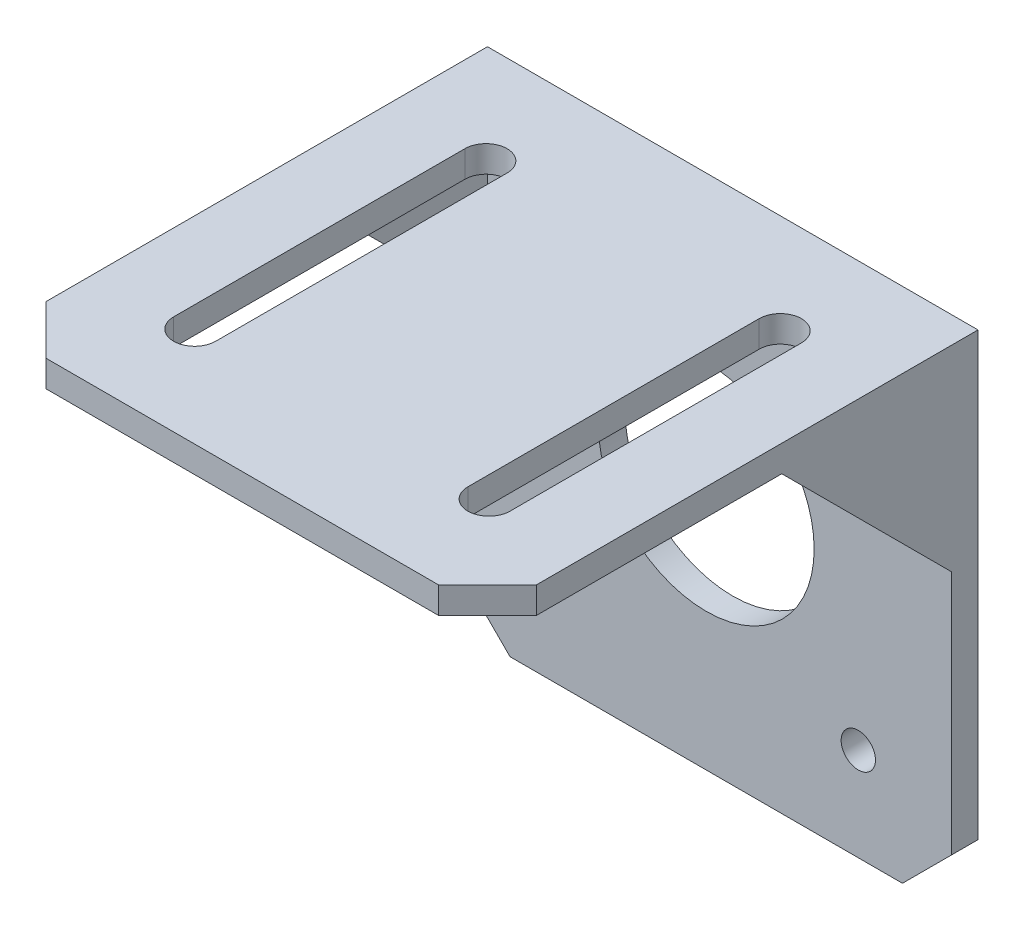
ISO-10303-21;
HEADER;
FILE_DESCRIPTION(('STEP AP214'),'2;1');
FILE_NAME('part.step','',(''),(''),'','','');
FILE_SCHEMA(('AUTOMOTIVE_DESIGN { 1 0 10303 214 1 1 1 1 }'));
ENDSEC;
DATA;
#1=APPLICATION_CONTEXT('core data for automotive mechanical design processes');
#2=APPLICATION_PROTOCOL_DEFINITION('international standard','automotive_design',2000,#1);
#3=PRODUCT_CONTEXT('',#1,'mechanical');
#4=PRODUCT('Part','Part','',(#3));
#5=PRODUCT_RELATED_PRODUCT_CATEGORY('part','',(#4));
#6=PRODUCT_DEFINITION_FORMATION('','',#4);
#7=PRODUCT_DEFINITION_CONTEXT('part definition',#1,'design');
#8=PRODUCT_DEFINITION('design','',#6,#7);
#9=PRODUCT_DEFINITION_SHAPE('','',#8);
#10=(LENGTH_UNIT() NAMED_UNIT(*) SI_UNIT(.MILLI.,.METRE.));
#11=(NAMED_UNIT(*) PLANE_ANGLE_UNIT() SI_UNIT($,.RADIAN.));
#12=(NAMED_UNIT(*) SI_UNIT($,.STERADIAN.) SOLID_ANGLE_UNIT());
#13=UNCERTAINTY_MEASURE_WITH_UNIT(LENGTH_MEASURE(1.E-05),#10,'distance_accuracy_value','');
#14=(GEOMETRIC_REPRESENTATION_CONTEXT(3) GLOBAL_UNCERTAINTY_ASSIGNED_CONTEXT((#13)) GLOBAL_UNIT_ASSIGNED_CONTEXT((#10,
#11,#12)) REPRESENTATION_CONTEXT('',''));
#15=CARTESIAN_POINT('',(0.,0.,0.));
#16=DIRECTION('',(0.,0.,1.));
#17=DIRECTION('',(1.,0.,0.));
#18=AXIS2_PLACEMENT_3D('',#15,#16,#17);
#19=CARTESIAN_POINT('',(0.,0.,0.));
#20=DIRECTION('',(0.,0.,1.));
#21=DIRECTION('',(1.,0.,0.));
#22=AXIS2_PLACEMENT_3D('',#19,#20,#21);
#23=PLANE('',#22);
#24=CARTESIAN_POINT('',(-15.5,15.5,0.));
#25=DIRECTION('',(0.,0.,-1.));
#26=DIRECTION('',(1.,0.,0.));
#27=AXIS2_PLACEMENT_3D('',#24,#25,#26);
#28=CIRCLE('',#27,1.75);
#29=CARTESIAN_POINT('',(-17.25,15.5,0.));
#30=VERTEX_POINT('',#29);
#31=EDGE_CURVE('E435',#30,#30,#28,.T.);
#32=ORIENTED_EDGE('',*,*,#31,.F.);
#33=EDGE_LOOP('',(#32));
#34=FACE_BOUND('',#33,.T.);
#35=CARTESIAN_POINT('',(-15.5,-15.5,0.));
#36=DIRECTION('',(0.,0.,-1.));
#37=DIRECTION('',(1.,0.,0.));
#38=AXIS2_PLACEMENT_3D('',#35,#36,#37);
#39=CIRCLE('',#38,1.75);
#40=CARTESIAN_POINT('',(-17.25,-15.5,0.));
#41=VERTEX_POINT('',#40);
#42=EDGE_CURVE('E367',#41,#41,#39,.T.);
#43=ORIENTED_EDGE('',*,*,#42,.F.);
#44=EDGE_LOOP('',(#43));
#45=FACE_BOUND('',#44,.T.);
#46=CARTESIAN_POINT('',(15.5,-15.5,0.));
#47=DIRECTION('',(0.,0.,-1.));
#48=DIRECTION('',(1.,0.,0.));
#49=AXIS2_PLACEMENT_3D('',#46,#47,#48);
#50=CIRCLE('',#49,1.75);
#51=CARTESIAN_POINT('',(13.75,-15.5,0.));
#52=VERTEX_POINT('',#51);
#53=EDGE_CURVE('E417',#52,#52,#50,.T.);
#54=ORIENTED_EDGE('',*,*,#53,.F.);
#55=EDGE_LOOP('',(#54));
#56=FACE_BOUND('',#55,.T.);
#57=CARTESIAN_POINT('',(0.,0.,0.));
#58=DIRECTION('',(0.,0.,-1.));
#59=DIRECTION('',(1.,0.,0.));
#60=AXIS2_PLACEMENT_3D('',#57,#58,#59);
#61=CIRCLE('',#60,11.);
#62=CARTESIAN_POINT('',(-11.,0.,0.));
#63=VERTEX_POINT('',#62);
#64=EDGE_CURVE('E307',#63,#63,#61,.T.);
#65=ORIENTED_EDGE('',*,*,#64,.F.);
#66=EDGE_LOOP('',(#65));
#67=FACE_BOUND('',#66,.T.);
#68=CARTESIAN_POINT('',(15.5,15.5,0.));
#69=DIRECTION('',(0.,0.,-1.));
#70=DIRECTION('',(1.,0.,0.));
#71=AXIS2_PLACEMENT_3D('',#68,#69,#70);
#72=CIRCLE('',#71,1.75);
#73=CARTESIAN_POINT('',(13.75,15.5,0.));
#74=VERTEX_POINT('',#73);
#75=EDGE_CURVE('E27',#74,#74,#72,.T.);
#76=ORIENTED_EDGE('',*,*,#75,.F.);
#77=EDGE_LOOP('',(#76));
#78=FACE_BOUND('',#77,.T.);
#79=DIRECTION('',(0.707106781186548,0.707106781186548,0.));
#80=VECTOR('',#79,1.);
#81=CARTESIAN_POINT('',(22.5,-22.5,0.));
#82=LINE('',#81,#80);
#83=CARTESIAN_POINT('',(20.,-25.,0.));
#84=VERTEX_POINT('',#83);
#85=CARTESIAN_POINT('',(25.,-20.,0.));
#86=VERTEX_POINT('',#85);
#87=EDGE_CURVE('E336',#84,#86,#82,.T.);
#88=ORIENTED_EDGE('',*,*,#87,.F.);
#89=DIRECTION('',(-1.,0.,0.));
#90=VECTOR('',#89,1.);
#91=CARTESIAN_POINT('',(25.,-25.,0.));
#92=LINE('',#91,#90);
#93=CARTESIAN_POINT('',(-20.,-25.,0.));
#94=VERTEX_POINT('',#93);
#95=EDGE_CURVE('E468',#84,#94,#92,.T.);
#96=ORIENTED_EDGE('',*,*,#95,.T.);
#97=DIRECTION('',(0.707106781186548,-0.707106781186548,0.));
#98=VECTOR('',#97,1.);
#99=CARTESIAN_POINT('',(-22.5,-22.5,0.));
#100=LINE('',#99,#98);
#101=CARTESIAN_POINT('',(-25.,-20.,0.));
#102=VERTEX_POINT('',#101);
#103=EDGE_CURVE('E329',#102,#94,#100,.T.);
#104=ORIENTED_EDGE('',*,*,#103,.F.);
#105=DIRECTION('',(0.,1.,0.));
#106=VECTOR('',#105,1.);
#107=CARTESIAN_POINT('',(-25.,-25.,0.));
#108=LINE('',#107,#106);
#109=CARTESIAN_POINT('',(-25.,25.,0.));
#110=VERTEX_POINT('',#109);
#111=EDGE_CURVE('E282',#102,#110,#108,.T.);
#112=ORIENTED_EDGE('',*,*,#111,.T.);
#113=DIRECTION('',(1.,0.,0.));
#114=VECTOR('',#113,1.);
#115=CARTESIAN_POINT('',(-25.,25.,0.));
#116=LINE('',#115,#114);
#117=CARTESIAN_POINT('',(25.,25.,0.));
#118=VERTEX_POINT('',#117);
#119=EDGE_CURVE('E392',#110,#118,#116,.T.);
#120=ORIENTED_EDGE('',*,*,#119,.T.);
#121=DIRECTION('',(0.,-1.,0.));
#122=VECTOR('',#121,1.);
#123=CARTESIAN_POINT('',(25.,25.,0.));
#124=LINE('',#123,#122);
#125=EDGE_CURVE('E11',#118,#86,#124,.T.);
#126=ORIENTED_EDGE('',*,*,#125,.T.);
#127=EDGE_LOOP('',(#88,#96,#104,#112,#120,#126));
#128=FACE_BOUND('',#127,.T.);
#129=ADVANCED_FACE('F16',(#34,#45,#56,#67,#78,#128),#23,.F.);
#130=CARTESIAN_POINT('',(25.,-25.,0.));
#131=DIRECTION('',(1.,0.,0.));
#132=DIRECTION('',(0.,1.,0.));
#133=AXIS2_PLACEMENT_3D('',#130,#131,#132);
#134=PLANE('',#133);
#135=DIRECTION('',(0.,0.,1.));
#136=VECTOR('',#135,1.);
#137=CARTESIAN_POINT('',(25.,-20.,0.));
#138=LINE('',#137,#136);
#139=CARTESIAN_POINT('',(25.,-20.,2.7));
#140=VERTEX_POINT('',#139);
#141=EDGE_CURVE('E331',#86,#140,#138,.T.);
#142=ORIENTED_EDGE('',*,*,#141,.F.);
#143=ORIENTED_EDGE('',*,*,#125,.F.);
#144=DIRECTION('',(0.,0.,1.));
#145=VECTOR('',#144,1.);
#146=CARTESIAN_POINT('',(25.,25.,0.));
#147=LINE('',#146,#145);
#148=CARTESIAN_POINT('',(25.,25.,45.));
#149=VERTEX_POINT('',#148);
#150=EDGE_CURVE('E352',#118,#149,#147,.T.);
#151=ORIENTED_EDGE('',*,*,#150,.T.);
#152=DIRECTION('',(0.,1.,0.));
#153=VECTOR('',#152,1.);
#154=CARTESIAN_POINT('',(25.,0.,45.));
#155=LINE('',#154,#153);
#156=CARTESIAN_POINT('',(25.,22.3,45.));
#157=VERTEX_POINT('',#156);
#158=EDGE_CURVE('E429',#157,#149,#155,.T.);
#159=ORIENTED_EDGE('',*,*,#158,.F.);
#160=DIRECTION('',(0.,0.,1.));
#161=VECTOR('',#160,1.);
#162=CARTESIAN_POINT('',(25.,22.3,50.));
#163=LINE('',#162,#161);
#164=CARTESIAN_POINT('',(25.,22.3,20.));
#165=VERTEX_POINT('',#164);
#166=EDGE_CURVE('E201',#165,#157,#163,.T.);
#167=ORIENTED_EDGE('',*,*,#166,.F.);
#168=DIRECTION('',(0.,0.707106781186548,0.707106781186548));
#169=VECTOR('',#168,1.);
#170=CARTESIAN_POINT('',(25.,5.,2.7));
#171=LINE('',#170,#169);
#172=CARTESIAN_POINT('',(25.,5.,2.7));
#173=VERTEX_POINT('',#172);
#174=EDGE_CURVE('E257',#173,#165,#171,.T.);
#175=ORIENTED_EDGE('',*,*,#174,.F.);
#176=DIRECTION('',(0.,1.,0.));
#177=VECTOR('',#176,1.);
#178=CARTESIAN_POINT('',(25.,25.,2.7));
#179=LINE('',#178,#177);
#180=EDGE_CURVE('E486',#140,#173,#179,.T.);
#181=ORIENTED_EDGE('',*,*,#180,.F.);
#182=EDGE_LOOP('',(#142,#143,#151,#159,#167,#175,#181));
#183=FACE_BOUND('',#182,.T.);
#184=ADVANCED_FACE('F572',(#183),#134,.T.);
#185=CARTESIAN_POINT('',(15.5,15.5,0.));
#186=DIRECTION('',(0.,0.,1.));
#187=DIRECTION('',(1.,0.,0.));
#188=AXIS2_PLACEMENT_3D('',#185,#186,#187);
#189=CYLINDRICAL_SURFACE('',#188,1.75);
#190=CARTESIAN_POINT('',(15.5,15.5,2.7));
#191=DIRECTION('',(0.,0.,-1.));
#192=DIRECTION('',(1.,0.,0.));
#193=AXIS2_PLACEMENT_3D('',#190,#191,#192);
#194=CIRCLE('',#193,1.75);
#195=CARTESIAN_POINT('',(13.75,15.5,2.7));
#196=VERTEX_POINT('',#195);
#197=EDGE_CURVE('E330',#196,#196,#194,.T.);
#198=ORIENTED_EDGE('',*,*,#197,.F.);
#199=DIRECTION('',(0.,0.,-1.));
#200=VECTOR('',#199,1.);
#201=CARTESIAN_POINT('',(13.75,15.5,0.));
#202=LINE('',#201,#200);
#203=EDGE_CURVE('E436',#196,#74,#202,.T.);
#204=ORIENTED_EDGE('',*,*,#203,.T.);
#205=ORIENTED_EDGE('',*,*,#75,.T.);
#206=ORIENTED_EDGE('',*,*,#203,.F.);
#207=EDGE_LOOP('',(#198,#204,#205,#206));
#208=FACE_BOUND('',#207,.T.);
#209=ADVANCED_FACE('F778',(#208),#189,.F.);
#210=CARTESIAN_POINT('',(0.,0.,0.));
#211=DIRECTION('',(0.,0.,1.));
#212=DIRECTION('',(1.,0.,0.));
#213=AXIS2_PLACEMENT_3D('',#210,#211,#212);
#214=CYLINDRICAL_SURFACE('',#213,11.);
#215=CARTESIAN_POINT('',(0.,0.,2.7));
#216=DIRECTION('',(0.,0.,-1.));
#217=DIRECTION('',(1.,0.,0.));
#218=AXIS2_PLACEMENT_3D('',#215,#216,#217);
#219=CIRCLE('',#218,11.);
#220=CARTESIAN_POINT('',(-11.,0.,2.7));
#221=VERTEX_POINT('',#220);
#222=EDGE_CURVE('E362',#221,#221,#219,.T.);
#223=ORIENTED_EDGE('',*,*,#222,.F.);
#224=DIRECTION('',(0.,0.,-1.));
#225=VECTOR('',#224,1.);
#226=CARTESIAN_POINT('',(-11.,0.,0.));
#227=LINE('',#226,#225);
#228=EDGE_CURVE('E267',#221,#63,#227,.T.);
#229=ORIENTED_EDGE('',*,*,#228,.T.);
#230=ORIENTED_EDGE('',*,*,#64,.T.);
#231=ORIENTED_EDGE('',*,*,#228,.F.);
#232=EDGE_LOOP('',(#223,#229,#230,#231));
#233=FACE_BOUND('',#232,.T.);
#234=ADVANCED_FACE('F772',(#233),#214,.F.);
#235=CARTESIAN_POINT('',(15.5,-15.5,0.));
#236=DIRECTION('',(0.,0.,1.));
#237=DIRECTION('',(1.,0.,0.));
#238=AXIS2_PLACEMENT_3D('',#235,#236,#237);
#239=CYLINDRICAL_SURFACE('',#238,1.75);
#240=CARTESIAN_POINT('',(15.5,-15.5,2.7));
#241=DIRECTION('',(0.,0.,-1.));
#242=DIRECTION('',(1.,0.,0.));
#243=AXIS2_PLACEMENT_3D('',#240,#241,#242);
#244=CIRCLE('',#243,1.75);
#245=CARTESIAN_POINT('',(13.75,-15.5,2.7));
#246=VERTEX_POINT('',#245);
#247=EDGE_CURVE('E358',#246,#246,#244,.T.);
#248=ORIENTED_EDGE('',*,*,#247,.F.);
#249=DIRECTION('',(0.,0.,-1.));
#250=VECTOR('',#249,1.);
#251=CARTESIAN_POINT('',(13.75,-15.5,0.));
#252=LINE('',#251,#250);
#253=EDGE_CURVE('E371',#246,#52,#252,.T.);
#254=ORIENTED_EDGE('',*,*,#253,.T.);
#255=ORIENTED_EDGE('',*,*,#53,.T.);
#256=ORIENTED_EDGE('',*,*,#253,.F.);
#257=EDGE_LOOP('',(#248,#254,#255,#256));
#258=FACE_BOUND('',#257,.T.);
#259=ADVANCED_FACE('F777',(#258),#239,.F.);
#260=CARTESIAN_POINT('',(-15.5,-15.5,0.));
#261=DIRECTION('',(0.,0.,1.));
#262=DIRECTION('',(1.,0.,0.));
#263=AXIS2_PLACEMENT_3D('',#260,#261,#262);
#264=CYLINDRICAL_SURFACE('',#263,1.75);
#265=CARTESIAN_POINT('',(-15.5,-15.5,2.7));
#266=DIRECTION('',(0.,0.,-1.));
#267=DIRECTION('',(1.,0.,0.));
#268=AXIS2_PLACEMENT_3D('',#265,#266,#267);
#269=CIRCLE('',#268,1.75);
#270=CARTESIAN_POINT('',(-17.25,-15.5,2.7));
#271=VERTEX_POINT('',#270);
#272=EDGE_CURVE('E363',#271,#271,#269,.T.);
#273=ORIENTED_EDGE('',*,*,#272,.F.);
#274=DIRECTION('',(0.,0.,-1.));
#275=VECTOR('',#274,1.);
#276=CARTESIAN_POINT('',(-17.25,-15.5,0.));
#277=LINE('',#276,#275);
#278=EDGE_CURVE('E372',#271,#41,#277,.T.);
#279=ORIENTED_EDGE('',*,*,#278,.T.);
#280=ORIENTED_EDGE('',*,*,#42,.T.);
#281=ORIENTED_EDGE('',*,*,#278,.F.);
#282=EDGE_LOOP('',(#273,#279,#280,#281));
#283=FACE_BOUND('',#282,.T.);
#284=ADVANCED_FACE('F18',(#283),#264,.F.);
#285=CARTESIAN_POINT('',(-15.5,15.5,0.));
#286=DIRECTION('',(0.,0.,1.));
#287=DIRECTION('',(1.,0.,0.));
#288=AXIS2_PLACEMENT_3D('',#285,#286,#287);
#289=CYLINDRICAL_SURFACE('',#288,1.75);
#290=CARTESIAN_POINT('',(-15.5,15.5,2.7));
#291=DIRECTION('',(0.,0.,-1.));
#292=DIRECTION('',(1.,0.,0.));
#293=AXIS2_PLACEMENT_3D('',#290,#291,#292);
#294=CIRCLE('',#293,1.75);
#295=CARTESIAN_POINT('',(-17.25,15.5,2.7));
#296=VERTEX_POINT('',#295);
#297=EDGE_CURVE('E385',#296,#296,#294,.T.);
#298=ORIENTED_EDGE('',*,*,#297,.F.);
#299=DIRECTION('',(0.,0.,-1.));
#300=VECTOR('',#299,1.);
#301=CARTESIAN_POINT('',(-17.25,15.5,0.));
#302=LINE('',#301,#300);
#303=EDGE_CURVE('E431',#296,#30,#302,.T.);
#304=ORIENTED_EDGE('',*,*,#303,.T.);
#305=ORIENTED_EDGE('',*,*,#31,.T.);
#306=ORIENTED_EDGE('',*,*,#303,.F.);
#307=EDGE_LOOP('',(#298,#304,#305,#306));
#308=FACE_BOUND('',#307,.T.);
#309=ADVANCED_FACE('F719',(#308),#289,.F.);
#310=CARTESIAN_POINT('',(0.,22.3,26.35));
#311=DIRECTION('',(0.,-1.,0.));
#312=DIRECTION('',(0.,0.,-1.));
#313=AXIS2_PLACEMENT_3D('',#310,#311,#312);
#314=PLANE('',#313);
#315=DIRECTION('',(0.,0.,1.));
#316=VECTOR('',#315,1.);
#317=CARTESIAN_POINT('',(-17.15,22.3,33.1));
#318=LINE('',#317,#316);
#319=CARTESIAN_POINT('',(-17.15,22.3,10.15));
#320=VERTEX_POINT('',#319);
#321=CARTESIAN_POINT('',(-17.15,22.3,39.85));
#322=VERTEX_POINT('',#321);
#323=EDGE_CURVE('E421',#320,#322,#318,.T.);
#324=ORIENTED_EDGE('',*,*,#323,.T.);
#325=CARTESIAN_POINT('',(-15.,22.3,39.85));
#326=DIRECTION('',(0.,1.,0.));
#327=DIRECTION('',(-1.,0.,0.));
#328=AXIS2_PLACEMENT_3D('',#325,#326,#327);
#329=CIRCLE('',#328,2.15);
#330=CARTESIAN_POINT('',(-12.85,22.3,39.85));
#331=VERTEX_POINT('',#330);
#332=EDGE_CURVE('E412',#322,#331,#329,.T.);
#333=ORIENTED_EDGE('',*,*,#332,.T.);
#334=DIRECTION('',(0.,0.,-1.));
#335=VECTOR('',#334,1.);
#336=CARTESIAN_POINT('',(-12.85,22.3,18.25));
#337=LINE('',#336,#335);
#338=CARTESIAN_POINT('',(-12.85,22.3,10.15));
#339=VERTEX_POINT('',#338);
#340=EDGE_CURVE('E346',#331,#339,#337,.T.);
#341=ORIENTED_EDGE('',*,*,#340,.T.);
#342=CARTESIAN_POINT('',(-15.,22.3,10.15));
#343=DIRECTION('',(0.,1.,0.));
#344=DIRECTION('',(1.,0.,0.));
#345=AXIS2_PLACEMENT_3D('',#342,#343,#344);
#346=CIRCLE('',#345,2.15);
#347=EDGE_CURVE('E345',#339,#320,#346,.T.);
#348=ORIENTED_EDGE('',*,*,#347,.T.);
#349=EDGE_LOOP('',(#324,#333,#341,#348));
#350=FACE_BOUND('',#349,.T.);
#351=DIRECTION('',(0.,0.,1.));
#352=VECTOR('',#351,1.);
#353=CARTESIAN_POINT('',(12.85,22.3,33.1));
#354=LINE('',#353,#352);
#355=CARTESIAN_POINT('',(12.85,22.3,10.15));
#356=VERTEX_POINT('',#355);
#357=CARTESIAN_POINT('',(12.85,22.3,39.85));
#358=VERTEX_POINT('',#357);
#359=EDGE_CURVE('E377',#356,#358,#354,.T.);
#360=ORIENTED_EDGE('',*,*,#359,.T.);
#361=CARTESIAN_POINT('',(15.,22.3,39.85));
#362=DIRECTION('',(0.,1.,0.));
#363=DIRECTION('',(-1.,0.,0.));
#364=AXIS2_PLACEMENT_3D('',#361,#362,#363);
#365=CIRCLE('',#364,2.15);
#366=CARTESIAN_POINT('',(17.15,22.3,39.85));
#367=VERTEX_POINT('',#366);
#368=EDGE_CURVE('E273',#358,#367,#365,.T.);
#369=ORIENTED_EDGE('',*,*,#368,.T.);
#370=DIRECTION('',(0.,0.,-1.));
#371=VECTOR('',#370,1.);
#372=CARTESIAN_POINT('',(17.15,22.3,18.25));
#373=LINE('',#372,#371);
#374=CARTESIAN_POINT('',(17.15,22.3,10.15));
#375=VERTEX_POINT('',#374);
#376=EDGE_CURVE('E314',#367,#375,#373,.T.);
#377=ORIENTED_EDGE('',*,*,#376,.T.);
#378=CARTESIAN_POINT('',(15.,22.3,10.15));
#379=DIRECTION('',(0.,1.,0.));
#380=DIRECTION('',(1.,0.,0.));
#381=AXIS2_PLACEMENT_3D('',#378,#379,#380);
#382=CIRCLE('',#381,2.15);
#383=EDGE_CURVE('E313',#375,#356,#382,.T.);
#384=ORIENTED_EDGE('',*,*,#383,.T.);
#385=EDGE_LOOP('',(#360,#369,#377,#384));
#386=FACE_BOUND('',#385,.T.);
#387=DIRECTION('',(0.707106781186548,0.,-0.707106781186548));
#388=VECTOR('',#387,1.);
#389=CARTESIAN_POINT('',(22.1625,22.3,47.8375));
#390=LINE('',#389,#388);
#391=CARTESIAN_POINT('',(20.,22.3,50.));
#392=VERTEX_POINT('',#391);
#393=EDGE_CURVE('E292',#392,#157,#390,.T.);
#394=ORIENTED_EDGE('',*,*,#393,.F.);
#395=DIRECTION('',(-1.,0.,0.));
#396=VECTOR('',#395,1.);
#397=CARTESIAN_POINT('',(-25.,22.3,50.));
#398=LINE('',#397,#396);
#399=CARTESIAN_POINT('',(-20.,22.3,50.));
#400=VERTEX_POINT('',#399);
#401=EDGE_CURVE('E192',#392,#400,#398,.T.);
#402=ORIENTED_EDGE('',*,*,#401,.T.);
#403=DIRECTION('',(0.707106781186549,0.,0.707106781186546));
#404=VECTOR('',#403,1.);
#405=CARTESIAN_POINT('',(-22.1625,22.3,47.8375));
#406=LINE('',#405,#404);
#407=CARTESIAN_POINT('',(-25.,22.3,45.));
#408=VERTEX_POINT('',#407);
#409=EDGE_CURVE('E357',#408,#400,#406,.T.);
#410=ORIENTED_EDGE('',*,*,#409,.F.);
#411=DIRECTION('',(0.,0.,-1.));
#412=VECTOR('',#411,1.);
#413=CARTESIAN_POINT('',(-25.,22.3,0.));
#414=LINE('',#413,#412);
#415=CARTESIAN_POINT('',(-25.,22.3,20.));
#416=VERTEX_POINT('',#415);
#417=EDGE_CURVE('E295',#408,#416,#414,.T.);
#418=ORIENTED_EDGE('',*,*,#417,.T.);
#419=DIRECTION('',(1.,0.,0.));
#420=VECTOR('',#419,1.);
#421=CARTESIAN_POINT('',(-12.5,22.3,20.));
#422=LINE('',#421,#420);
#423=CARTESIAN_POINT('',(-22.3,22.3,20.));
#424=VERTEX_POINT('',#423);
#425=EDGE_CURVE('E356',#416,#424,#422,.T.);
#426=ORIENTED_EDGE('',*,*,#425,.T.);
#427=DIRECTION('',(0.,0.,-1.));
#428=VECTOR('',#427,1.);
#429=CARTESIAN_POINT('',(-22.3,22.3,18.85));
#430=LINE('',#429,#428);
#431=CARTESIAN_POINT('',(-22.3,22.3,2.7));
#432=VERTEX_POINT('',#431);
#433=EDGE_CURVE('E169',#424,#432,#430,.T.);
#434=ORIENTED_EDGE('',*,*,#433,.T.);
#435=DIRECTION('',(-1.,0.,0.));
#436=VECTOR('',#435,1.);
#437=CARTESIAN_POINT('',(0.,22.3,2.7));
#438=LINE('',#437,#436);
#439=CARTESIAN_POINT('',(22.3,22.3,2.7));
#440=VERTEX_POINT('',#439);
#441=EDGE_CURVE('E241',#440,#432,#438,.T.);
#442=ORIENTED_EDGE('',*,*,#441,.F.);
#443=DIRECTION('',(0.,0.,1.));
#444=VECTOR('',#443,1.);
#445=CARTESIAN_POINT('',(22.3,22.3,18.85));
#446=LINE('',#445,#444);
#447=CARTESIAN_POINT('',(22.3,22.3,20.));
#448=VERTEX_POINT('',#447);
#449=EDGE_CURVE('E234',#440,#448,#446,.T.);
#450=ORIENTED_EDGE('',*,*,#449,.T.);
#451=DIRECTION('',(1.,0.,0.));
#452=VECTOR('',#451,1.);
#453=CARTESIAN_POINT('',(12.5,22.3,20.));
#454=LINE('',#453,#452);
#455=EDGE_CURVE('E238',#448,#165,#454,.T.);
#456=ORIENTED_EDGE('',*,*,#455,.T.);
#457=ORIENTED_EDGE('',*,*,#166,.T.);
#458=EDGE_LOOP('',(#394,#402,#410,#418,#426,#434,#442,#450,#456,#457));
#459=FACE_BOUND('',#458,.T.);
#460=ADVANCED_FACE('F236',(#350,#386,#459),#314,.T.);
#461=CARTESIAN_POINT('',(22.3,13.65,11.35));
#462=DIRECTION('',(-1.,0.,0.));
#463=DIRECTION('',(0.,0.,1.));
#464=AXIS2_PLACEMENT_3D('',#461,#462,#463);
#465=PLANE('',#464);
#466=DIRECTION('',(0.,1.,0.));
#467=VECTOR('',#466,1.);
#468=CARTESIAN_POINT('',(22.3,6.825,2.7));
#469=LINE('',#468,#467);
#470=CARTESIAN_POINT('',(22.3,5.,2.7));
#471=VERTEX_POINT('',#470);
#472=EDGE_CURVE('E250',#471,#440,#469,.T.);
#473=ORIENTED_EDGE('',*,*,#472,.F.);
#474=DIRECTION('',(0.,0.707106781186548,0.707106781186548));
#475=VECTOR('',#474,1.);
#476=CARTESIAN_POINT('',(22.3,5.,2.7));
#477=LINE('',#476,#475);
#478=EDGE_CURVE('E246',#471,#448,#477,.T.);
#479=ORIENTED_EDGE('',*,*,#478,.T.);
#480=ORIENTED_EDGE('',*,*,#449,.F.);
#481=EDGE_LOOP('',(#473,#479,#480));
#482=FACE_BOUND('',#481,.T.);
#483=ADVANCED_FACE('F249',(#482),#465,.T.);
#484=CARTESIAN_POINT('',(25.,5.,2.7));
#485=DIRECTION('',(0.,-0.707106781186548,0.707106781186548));
#486=DIRECTION('',(-1.,0.,0.));
#487=AXIS2_PLACEMENT_3D('',#484,#485,#486);
#488=PLANE('',#487);
#489=ORIENTED_EDGE('',*,*,#174,.T.);
#490=ORIENTED_EDGE('',*,*,#455,.F.);
#491=ORIENTED_EDGE('',*,*,#478,.F.);
#492=DIRECTION('',(-1.,0.,0.));
#493=VECTOR('',#492,1.);
#494=CARTESIAN_POINT('',(12.5,5.,2.7));
#495=LINE('',#494,#493);
#496=EDGE_CURVE('E341',#173,#471,#495,.T.);
#497=ORIENTED_EDGE('',*,*,#496,.F.);
#498=EDGE_LOOP('',(#489,#490,#491,#497));
#499=FACE_BOUND('',#498,.T.);
#500=ADVANCED_FACE('F256',(#499),#488,.T.);
#501=CARTESIAN_POINT('',(-22.3,13.65,11.35));
#502=DIRECTION('',(1.,0.,0.));
#503=DIRECTION('',(0.,1.,0.));
#504=AXIS2_PLACEMENT_3D('',#501,#502,#503);
#505=PLANE('',#504);
#506=ORIENTED_EDGE('',*,*,#433,.F.);
#507=DIRECTION('',(0.,-0.707106781186548,-0.707106781186548));
#508=VECTOR('',#507,1.);
#509=CARTESIAN_POINT('',(-22.3,5.,2.7));
#510=LINE('',#509,#508);
#511=CARTESIAN_POINT('',(-22.3,5.,2.7));
#512=VERTEX_POINT('',#511);
#513=EDGE_CURVE('E153',#424,#512,#510,.T.);
#514=ORIENTED_EDGE('',*,*,#513,.T.);
#515=DIRECTION('',(0.,-1.,0.));
#516=VECTOR('',#515,1.);
#517=CARTESIAN_POINT('',(-22.3,6.825,2.7));
#518=LINE('',#517,#516);
#519=EDGE_CURVE('E278',#432,#512,#518,.T.);
#520=ORIENTED_EDGE('',*,*,#519,.F.);
#521=EDGE_LOOP('',(#506,#514,#520));
#522=FACE_BOUND('',#521,.T.);
#523=ADVANCED_FACE('F737',(#522),#505,.T.);
#524=CARTESIAN_POINT('',(-25.,22.3,20.));
#525=DIRECTION('',(0.,-0.707106781186548,0.707106781186548));
#526=DIRECTION('',(-1.,0.,0.));
#527=AXIS2_PLACEMENT_3D('',#524,#525,#526);
#528=PLANE('',#527);
#529=DIRECTION('',(0.,0.707106781186548,0.707106781186548));
#530=VECTOR('',#529,1.);
#531=CARTESIAN_POINT('',(-25.,5.,2.7));
#532=LINE('',#531,#530);
#533=CARTESIAN_POINT('',(-25.,5.,2.7));
#534=VERTEX_POINT('',#533);
#535=EDGE_CURVE('E303',#534,#416,#532,.T.);
#536=ORIENTED_EDGE('',*,*,#535,.F.);
#537=DIRECTION('',(-1.,0.,0.));
#538=VECTOR('',#537,1.);
#539=CARTESIAN_POINT('',(-12.5,5.,2.7));
#540=LINE('',#539,#538);
#541=EDGE_CURVE('E274',#512,#534,#540,.T.);
#542=ORIENTED_EDGE('',*,*,#541,.F.);
#543=ORIENTED_EDGE('',*,*,#513,.F.);
#544=ORIENTED_EDGE('',*,*,#425,.F.);
#545=EDGE_LOOP('',(#536,#542,#543,#544));
#546=FACE_BOUND('',#545,.T.);
#547=ADVANCED_FACE('F806',(#546),#528,.T.);
#548=CARTESIAN_POINT('',(-22.5,25.,47.5));
#549=DIRECTION('',(-0.707106781186546,0.,0.707106781186549));
#550=DIRECTION('',(0.,1.,0.));
#551=AXIS2_PLACEMENT_3D('',#548,#549,#550);
#552=PLANE('',#551);
#553=ORIENTED_EDGE('',*,*,#409,.T.);
#554=DIRECTION('',(0.,1.,0.));
#555=VECTOR('',#554,1.);
#556=CARTESIAN_POINT('',(-20.,25.,50.));
#557=LINE('',#556,#555);
#558=CARTESIAN_POINT('',(-20.,25.,50.));
#559=VERTEX_POINT('',#558);
#560=EDGE_CURVE('E353',#400,#559,#557,.T.);
#561=ORIENTED_EDGE('',*,*,#560,.T.);
#562=DIRECTION('',(-0.707106781186549,0.,-0.707106781186546));
#563=VECTOR('',#562,1.);
#564=CARTESIAN_POINT('',(-22.5,25.,47.5));
#565=LINE('',#564,#563);
#566=CARTESIAN_POINT('',(-25.,25.,45.));
#567=VERTEX_POINT('',#566);
#568=EDGE_CURVE('E387',#559,#567,#565,.T.);
#569=ORIENTED_EDGE('',*,*,#568,.T.);
#570=DIRECTION('',(0.,-1.,0.));
#571=VECTOR('',#570,1.);
#572=CARTESIAN_POINT('',(-25.,25.,45.));
#573=LINE('',#572,#571);
#574=EDGE_CURVE('E283',#567,#408,#573,.T.);
#575=ORIENTED_EDGE('',*,*,#574,.T.);
#576=EDGE_LOOP('',(#553,#561,#569,#575));
#577=FACE_BOUND('',#576,.T.);
#578=ADVANCED_FACE('F811',(#577),#552,.T.);
#579=CARTESIAN_POINT('',(25.,25.,0.));
#580=DIRECTION('',(0.,1.,0.));
#581=DIRECTION('',(1.,0.,0.));
#582=AXIS2_PLACEMENT_3D('',#579,#580,#581);
#583=PLANE('',#582);
#584=DIRECTION('',(0.,0.,-1.));
#585=VECTOR('',#584,1.);
#586=CARTESIAN_POINT('',(-17.15,25.,19.925));
#587=LINE('',#586,#585);
#588=CARTESIAN_POINT('',(-17.15,25.,39.85));
#589=VERTEX_POINT('',#588);
#590=CARTESIAN_POINT('',(-17.15,25.,10.15));
#591=VERTEX_POINT('',#590);
#592=EDGE_CURVE('E441',#589,#591,#587,.T.);
#593=ORIENTED_EDGE('',*,*,#592,.T.);
#594=CARTESIAN_POINT('',(-15.,25.,10.15));
#595=DIRECTION('',(0.,-1.,0.));
#596=DIRECTION('',(1.,0.,0.));
#597=AXIS2_PLACEMENT_3D('',#594,#595,#596);
#598=CIRCLE('',#597,2.15);
#599=CARTESIAN_POINT('',(-12.85,25.,10.15));
#600=VERTEX_POINT('',#599);
#601=EDGE_CURVE('E342',#591,#600,#598,.T.);
#602=ORIENTED_EDGE('',*,*,#601,.T.);
#603=DIRECTION('',(0.,0.,1.));
#604=VECTOR('',#603,1.);
#605=CARTESIAN_POINT('',(-12.85,25.,5.075));
#606=LINE('',#605,#604);
#607=CARTESIAN_POINT('',(-12.85,25.,39.85));
#608=VERTEX_POINT('',#607);
#609=EDGE_CURVE('E478',#600,#608,#606,.T.);
#610=ORIENTED_EDGE('',*,*,#609,.T.);
#611=CARTESIAN_POINT('',(-15.,25.,39.85));
#612=DIRECTION('',(0.,-1.,0.));
#613=DIRECTION('',(-1.,0.,0.));
#614=AXIS2_PLACEMENT_3D('',#611,#612,#613);
#615=CIRCLE('',#614,2.15);
#616=EDGE_CURVE('E413',#608,#589,#615,.T.);
#617=ORIENTED_EDGE('',*,*,#616,.T.);
#618=EDGE_LOOP('',(#593,#602,#610,#617));
#619=FACE_BOUND('',#618,.T.);
#620=DIRECTION('',(0.,0.,-1.));
#621=VECTOR('',#620,1.);
#622=CARTESIAN_POINT('',(12.85,25.,19.925));
#623=LINE('',#622,#621);
#624=CARTESIAN_POINT('',(12.85,25.,39.85));
#625=VERTEX_POINT('',#624);
#626=CARTESIAN_POINT('',(12.85,25.,10.15));
#627=VERTEX_POINT('',#626);
#628=EDGE_CURVE('E382',#625,#627,#623,.T.);
#629=ORIENTED_EDGE('',*,*,#628,.T.);
#630=CARTESIAN_POINT('',(15.,25.,10.15));
#631=DIRECTION('',(0.,-1.,0.));
#632=DIRECTION('',(1.,0.,0.));
#633=AXIS2_PLACEMENT_3D('',#630,#631,#632);
#634=CIRCLE('',#633,2.15);
#635=CARTESIAN_POINT('',(17.15,25.,10.15));
#636=VERTEX_POINT('',#635);
#637=EDGE_CURVE('E309',#627,#636,#634,.T.);
#638=ORIENTED_EDGE('',*,*,#637,.T.);
#639=DIRECTION('',(0.,0.,1.));
#640=VECTOR('',#639,1.);
#641=CARTESIAN_POINT('',(17.15,25.,5.075));
#642=LINE('',#641,#640);
#643=CARTESIAN_POINT('',(17.15,25.,39.85));
#644=VERTEX_POINT('',#643);
#645=EDGE_CURVE('E269',#636,#644,#642,.T.);
#646=ORIENTED_EDGE('',*,*,#645,.T.);
#647=CARTESIAN_POINT('',(15.,25.,39.85));
#648=DIRECTION('',(0.,-1.,0.));
#649=DIRECTION('',(-1.,0.,0.));
#650=AXIS2_PLACEMENT_3D('',#647,#648,#649);
#651=CIRCLE('',#650,2.15);
#652=EDGE_CURVE('E319',#644,#625,#651,.T.);
#653=ORIENTED_EDGE('',*,*,#652,.T.);
#654=EDGE_LOOP('',(#629,#638,#646,#653));
#655=FACE_BOUND('',#654,.T.);
#656=DIRECTION('',(-0.707106781186548,0.,0.707106781186548));
#657=VECTOR('',#656,1.);
#658=CARTESIAN_POINT('',(35.,25.,35.));
#659=LINE('',#658,#657);
#660=CARTESIAN_POINT('',(20.,25.,50.));
#661=VERTEX_POINT('',#660);
#662=EDGE_CURVE('E324',#149,#661,#659,.T.);
#663=ORIENTED_EDGE('',*,*,#662,.F.);
#664=ORIENTED_EDGE('',*,*,#150,.F.);
#665=ORIENTED_EDGE('',*,*,#119,.F.);
#666=DIRECTION('',(0.,0.,1.));
#667=VECTOR('',#666,1.);
#668=CARTESIAN_POINT('',(-25.,25.,0.));
#669=LINE('',#668,#667);
#670=EDGE_CURVE('E279',#110,#567,#669,.T.);
#671=ORIENTED_EDGE('',*,*,#670,.T.);
#672=ORIENTED_EDGE('',*,*,#568,.F.);
#673=DIRECTION('',(1.,0.,0.));
#674=VECTOR('',#673,1.);
#675=CARTESIAN_POINT('',(-25.,25.,50.));
#676=LINE('',#675,#674);
#677=EDGE_CURVE('E323',#559,#661,#676,.T.);
#678=ORIENTED_EDGE('',*,*,#677,.T.);
#679=EDGE_LOOP('',(#663,#664,#665,#671,#672,#678));
#680=FACE_BOUND('',#679,.T.);
#681=ADVANCED_FACE('F800',(#619,#655,#680),#583,.T.);
#682=CARTESIAN_POINT('',(25.,25.,50.));
#683=DIRECTION('',(0.,0.,1.));
#684=DIRECTION('',(1.,0.,0.));
#685=AXIS2_PLACEMENT_3D('',#682,#683,#684);
#686=PLANE('',#685);
#687=DIRECTION('',(0.,-1.,0.));
#688=VECTOR('',#687,1.);
#689=CARTESIAN_POINT('',(20.,0.,50.));
#690=LINE('',#689,#688);
#691=EDGE_CURVE('E320',#661,#392,#690,.T.);
#692=ORIENTED_EDGE('',*,*,#691,.F.);
#693=ORIENTED_EDGE('',*,*,#677,.F.);
#694=ORIENTED_EDGE('',*,*,#560,.F.);
#695=ORIENTED_EDGE('',*,*,#401,.F.);
#696=EDGE_LOOP('',(#692,#693,#694,#695));
#697=FACE_BOUND('',#696,.T.);
#698=ADVANCED_FACE('F622',(#697),#686,.T.);
#699=CARTESIAN_POINT('',(22.5,0.,47.5));
#700=DIRECTION('',(0.707106781186548,0.,0.707106781186548));
#701=DIRECTION('',(0.,-1.,0.));
#702=AXIS2_PLACEMENT_3D('',#699,#700,#701);
#703=PLANE('',#702);
#704=ORIENTED_EDGE('',*,*,#393,.T.);
#705=ORIENTED_EDGE('',*,*,#158,.T.);
#706=ORIENTED_EDGE('',*,*,#662,.T.);
#707=ORIENTED_EDGE('',*,*,#691,.T.);
#708=EDGE_LOOP('',(#704,#705,#706,#707));
#709=FACE_BOUND('',#708,.T.);
#710=ADVANCED_FACE('F786',(#709),#703,.T.);
#711=CARTESIAN_POINT('',(-25.,25.,0.));
#712=DIRECTION('',(-1.,0.,0.));
#713=DIRECTION('',(0.,0.,1.));
#714=AXIS2_PLACEMENT_3D('',#711,#712,#713);
#715=PLANE('',#714);
#716=DIRECTION('',(0.,0.,-1.));
#717=VECTOR('',#716,1.);
#718=CARTESIAN_POINT('',(-25.,-20.,0.));
#719=LINE('',#718,#717);
#720=CARTESIAN_POINT('',(-25.,-20.,2.7));
#721=VERTEX_POINT('',#720);
#722=EDGE_CURVE('E325',#721,#102,#719,.T.);
#723=ORIENTED_EDGE('',*,*,#722,.F.);
#724=DIRECTION('',(0.,-1.,0.));
#725=VECTOR('',#724,1.);
#726=CARTESIAN_POINT('',(-25.,-25.,2.7));
#727=LINE('',#726,#725);
#728=EDGE_CURVE('E277',#534,#721,#727,.T.);
#729=ORIENTED_EDGE('',*,*,#728,.F.);
#730=ORIENTED_EDGE('',*,*,#535,.T.);
#731=ORIENTED_EDGE('',*,*,#417,.F.);
#732=ORIENTED_EDGE('',*,*,#574,.F.);
#733=ORIENTED_EDGE('',*,*,#670,.F.);
#734=ORIENTED_EDGE('',*,*,#111,.F.);
#735=EDGE_LOOP('',(#723,#729,#730,#731,#732,#733,#734));
#736=FACE_BOUND('',#735,.T.);
#737=ADVANCED_FACE('F555',(#736),#715,.T.);
#738=CARTESIAN_POINT('',(-22.5,-22.5,0.));
#739=DIRECTION('',(-0.707106781186548,-0.707106781186548,0.));
#740=DIRECTION('',(-0.707106781186548,0.707106781186548,0.));
#741=AXIS2_PLACEMENT_3D('',#738,#739,#740);
#742=PLANE('',#741);
#743=DIRECTION('',(-0.707106781186548,0.707106781186548,0.));
#744=VECTOR('',#743,1.);
#745=CARTESIAN_POINT('',(-22.5,-22.5,2.7));
#746=LINE('',#745,#744);
#747=CARTESIAN_POINT('',(-20.,-25.,2.7));
#748=VERTEX_POINT('',#747);
#749=EDGE_CURVE('E461',#748,#721,#746,.T.);
#750=ORIENTED_EDGE('',*,*,#749,.T.);
#751=ORIENTED_EDGE('',*,*,#722,.T.);
#752=ORIENTED_EDGE('',*,*,#103,.T.);
#753=DIRECTION('',(0.,0.,1.));
#754=VECTOR('',#753,1.);
#755=CARTESIAN_POINT('',(-20.,-25.,0.));
#756=LINE('',#755,#754);
#757=EDGE_CURVE('E465',#94,#748,#756,.T.);
#758=ORIENTED_EDGE('',*,*,#757,.T.);
#759=EDGE_LOOP('',(#750,#751,#752,#758));
#760=FACE_BOUND('',#759,.T.);
#761=ADVANCED_FACE('F559',(#760),#742,.T.);
#762=CARTESIAN_POINT('',(0.,0.,2.7));
#763=DIRECTION('',(0.,0.,1.));
#764=DIRECTION('',(1.,0.,0.));
#765=AXIS2_PLACEMENT_3D('',#762,#763,#764);
#766=PLANE('',#765);
#767=ORIENTED_EDGE('',*,*,#197,.T.);
#768=EDGE_LOOP('',(#767));
#769=FACE_BOUND('',#768,.T.);
#770=ORIENTED_EDGE('',*,*,#222,.T.);
#771=EDGE_LOOP('',(#770));
#772=FACE_BOUND('',#771,.T.);
#773=ORIENTED_EDGE('',*,*,#247,.T.);
#774=EDGE_LOOP('',(#773));
#775=FACE_BOUND('',#774,.T.);
#776=ORIENTED_EDGE('',*,*,#272,.T.);
#777=EDGE_LOOP('',(#776));
#778=FACE_BOUND('',#777,.T.);
#779=ORIENTED_EDGE('',*,*,#297,.T.);
#780=EDGE_LOOP('',(#779));
#781=FACE_BOUND('',#780,.T.);
#782=DIRECTION('',(-0.707106781186548,-0.707106781186548,0.));
#783=VECTOR('',#782,1.);
#784=CARTESIAN_POINT('',(22.5,-22.5,2.7));
#785=LINE('',#784,#783);
#786=CARTESIAN_POINT('',(20.,-25.,2.7));
#787=VERTEX_POINT('',#786);
#788=EDGE_CURVE('E416',#140,#787,#785,.T.);
#789=ORIENTED_EDGE('',*,*,#788,.F.);
#790=ORIENTED_EDGE('',*,*,#180,.T.);
#791=ORIENTED_EDGE('',*,*,#496,.T.);
#792=ORIENTED_EDGE('',*,*,#472,.T.);
#793=ORIENTED_EDGE('',*,*,#441,.T.);
#794=ORIENTED_EDGE('',*,*,#519,.T.);
#795=ORIENTED_EDGE('',*,*,#541,.T.);
#796=ORIENTED_EDGE('',*,*,#728,.T.);
#797=ORIENTED_EDGE('',*,*,#749,.F.);
#798=DIRECTION('',(1.,0.,0.));
#799=VECTOR('',#798,1.);
#800=CARTESIAN_POINT('',(25.,-25.,2.7));
#801=LINE('',#800,#799);
#802=EDGE_CURVE('E335',#748,#787,#801,.T.);
#803=ORIENTED_EDGE('',*,*,#802,.T.);
#804=EDGE_LOOP('',(#789,#790,#791,#792,#793,#794,#795,#796,#797,#803));
#805=FACE_BOUND('',#804,.T.);
#806=ADVANCED_FACE('F552',(#769,#772,#775,#778,#781,#805),#766,.T.);
#807=CARTESIAN_POINT('',(-25.,-25.,0.));
#808=DIRECTION('',(0.,-1.,0.));
#809=DIRECTION('',(0.,0.,-1.));
#810=AXIS2_PLACEMENT_3D('',#807,#808,#809);
#811=PLANE('',#810);
#812=DIRECTION('',(0.,0.,-1.));
#813=VECTOR('',#812,1.);
#814=CARTESIAN_POINT('',(20.,-25.,0.));
#815=LINE('',#814,#813);
#816=EDGE_CURVE('E20',#787,#84,#815,.T.);
#817=ORIENTED_EDGE('',*,*,#816,.F.);
#818=ORIENTED_EDGE('',*,*,#802,.F.);
#819=ORIENTED_EDGE('',*,*,#757,.F.);
#820=ORIENTED_EDGE('',*,*,#95,.F.);
#821=EDGE_LOOP('',(#817,#818,#819,#820));
#822=FACE_BOUND('',#821,.T.);
#823=ADVANCED_FACE('F564',(#822),#811,.T.);
#824=CARTESIAN_POINT('',(22.5,-22.5,0.));
#825=DIRECTION('',(0.707106781186548,-0.707106781186548,0.));
#826=DIRECTION('',(0.,0.,-1.));
#827=AXIS2_PLACEMENT_3D('',#824,#825,#826);
#828=PLANE('',#827);
#829=ORIENTED_EDGE('',*,*,#788,.T.);
#830=ORIENTED_EDGE('',*,*,#816,.T.);
#831=ORIENTED_EDGE('',*,*,#87,.T.);
#832=ORIENTED_EDGE('',*,*,#141,.T.);
#833=EDGE_LOOP('',(#829,#830,#831,#832));
#834=FACE_BOUND('',#833,.T.);
#835=ADVANCED_FACE('F567',(#834),#828,.T.);
#836=CARTESIAN_POINT('',(-15.,25.,10.15));
#837=DIRECTION('',(0.,-1.,0.));
#838=DIRECTION('',(1.,0.,0.));
#839=AXIS2_PLACEMENT_3D('',#836,#837,#838);
#840=CYLINDRICAL_SURFACE('',#839,2.15);
#841=ORIENTED_EDGE('',*,*,#601,.F.);
#842=DIRECTION('',(0.,-1.,0.));
#843=VECTOR('',#842,1.);
#844=CARTESIAN_POINT('',(-17.15,25.,10.15));
#845=LINE('',#844,#843);
#846=EDGE_CURVE('E425',#591,#320,#845,.T.);
#847=ORIENTED_EDGE('',*,*,#846,.T.);
#848=ORIENTED_EDGE('',*,*,#347,.F.);
#849=DIRECTION('',(0.,-1.,0.));
#850=VECTOR('',#849,1.);
#851=CARTESIAN_POINT('',(-12.85,25.,10.15));
#852=LINE('',#851,#850);
#853=EDGE_CURVE('E406',#600,#339,#852,.T.);
#854=ORIENTED_EDGE('',*,*,#853,.F.);
#855=EDGE_LOOP('',(#841,#847,#848,#854));
#856=FACE_BOUND('',#855,.T.);
#857=ADVANCED_FACE('F766',(#856),#840,.F.);
#858=CARTESIAN_POINT('',(-12.85,25.,10.15));
#859=DIRECTION('',(1.,0.,0.));
#860=DIRECTION('',(0.,1.,0.));
#861=AXIS2_PLACEMENT_3D('',#858,#859,#860);
#862=PLANE('',#861);
#863=ORIENTED_EDGE('',*,*,#609,.F.);
#864=ORIENTED_EDGE('',*,*,#853,.T.);
#865=ORIENTED_EDGE('',*,*,#340,.F.);
#866=DIRECTION('',(0.,-1.,0.));
#867=VECTOR('',#866,1.);
#868=CARTESIAN_POINT('',(-12.85,25.,39.85));
#869=LINE('',#868,#867);
#870=EDGE_CURVE('E408',#608,#331,#869,.T.);
#871=ORIENTED_EDGE('',*,*,#870,.F.);
#872=EDGE_LOOP('',(#863,#864,#865,#871));
#873=FACE_BOUND('',#872,.T.);
#874=ADVANCED_FACE('F831',(#873),#862,.F.);
#875=CARTESIAN_POINT('',(-15.,25.,39.85));
#876=DIRECTION('',(0.,-1.,0.));
#877=DIRECTION('',(-1.,0.,0.));
#878=AXIS2_PLACEMENT_3D('',#875,#876,#877);
#879=CYLINDRICAL_SURFACE('',#878,2.15);
#880=ORIENTED_EDGE('',*,*,#616,.F.);
#881=ORIENTED_EDGE('',*,*,#870,.T.);
#882=ORIENTED_EDGE('',*,*,#332,.F.);
#883=DIRECTION('',(0.,-1.,0.));
#884=VECTOR('',#883,1.);
#885=CARTESIAN_POINT('',(-17.15,25.,39.85));
#886=LINE('',#885,#884);
#887=EDGE_CURVE('E426',#589,#322,#886,.T.);
#888=ORIENTED_EDGE('',*,*,#887,.F.);
#889=EDGE_LOOP('',(#880,#881,#882,#888));
#890=FACE_BOUND('',#889,.T.);
#891=ADVANCED_FACE('F836',(#890),#879,.F.);
#892=CARTESIAN_POINT('',(-17.15,25.,39.85));
#893=DIRECTION('',(-1.,0.,0.));
#894=DIRECTION('',(0.,0.,1.));
#895=AXIS2_PLACEMENT_3D('',#892,#893,#894);
#896=PLANE('',#895);
#897=ORIENTED_EDGE('',*,*,#592,.F.);
#898=ORIENTED_EDGE('',*,*,#887,.T.);
#899=ORIENTED_EDGE('',*,*,#323,.F.);
#900=ORIENTED_EDGE('',*,*,#846,.F.);
#901=EDGE_LOOP('',(#897,#898,#899,#900));
#902=FACE_BOUND('',#901,.T.);
#903=ADVANCED_FACE('F824',(#902),#896,.F.);
#904=CARTESIAN_POINT('',(15.,25.,10.15));
#905=DIRECTION('',(0.,-1.,0.));
#906=DIRECTION('',(1.,0.,0.));
#907=AXIS2_PLACEMENT_3D('',#904,#905,#906);
#908=CYLINDRICAL_SURFACE('',#907,2.15);
#909=ORIENTED_EDGE('',*,*,#637,.F.);
#910=DIRECTION('',(0.,-1.,0.));
#911=VECTOR('',#910,1.);
#912=CARTESIAN_POINT('',(12.85,25.,10.15));
#913=LINE('',#912,#911);
#914=EDGE_CURVE('E373',#627,#356,#913,.T.);
#915=ORIENTED_EDGE('',*,*,#914,.T.);
#916=ORIENTED_EDGE('',*,*,#383,.F.);
#917=DIRECTION('',(0.,-1.,0.));
#918=VECTOR('',#917,1.);
#919=CARTESIAN_POINT('',(17.15,25.,10.15));
#920=LINE('',#919,#918);
#921=EDGE_CURVE('E272',#636,#375,#920,.T.);
#922=ORIENTED_EDGE('',*,*,#921,.F.);
#923=EDGE_LOOP('',(#909,#915,#916,#922));
#924=FACE_BOUND('',#923,.T.);
#925=ADVANCED_FACE('F818',(#924),#908,.F.);
#926=CARTESIAN_POINT('',(17.15,25.,10.15));
#927=DIRECTION('',(1.,0.,0.));
#928=DIRECTION('',(0.,1.,0.));
#929=AXIS2_PLACEMENT_3D('',#926,#927,#928);
#930=PLANE('',#929);
#931=ORIENTED_EDGE('',*,*,#645,.F.);
#932=ORIENTED_EDGE('',*,*,#921,.T.);
#933=ORIENTED_EDGE('',*,*,#376,.F.);
#934=DIRECTION('',(0.,-1.,0.));
#935=VECTOR('',#934,1.);
#936=CARTESIAN_POINT('',(17.15,25.,39.85));
#937=LINE('',#936,#935);
#938=EDGE_CURVE('E315',#644,#367,#937,.T.);
#939=ORIENTED_EDGE('',*,*,#938,.F.);
#940=EDGE_LOOP('',(#931,#932,#933,#939));
#941=FACE_BOUND('',#940,.T.);
#942=ADVANCED_FACE('F823',(#941),#930,.F.);
#943=CARTESIAN_POINT('',(15.,25.,39.85));
#944=DIRECTION('',(0.,-1.,0.));
#945=DIRECTION('',(-1.,0.,0.));
#946=AXIS2_PLACEMENT_3D('',#943,#944,#945);
#947=CYLINDRICAL_SURFACE('',#946,2.15);
#948=ORIENTED_EDGE('',*,*,#652,.F.);
#949=ORIENTED_EDGE('',*,*,#938,.T.);
#950=ORIENTED_EDGE('',*,*,#368,.F.);
#951=DIRECTION('',(0.,-1.,0.));
#952=VECTOR('',#951,1.);
#953=CARTESIAN_POINT('',(12.85,25.,39.85));
#954=LINE('',#953,#952);
#955=EDGE_CURVE('E378',#625,#358,#954,.T.);
#956=ORIENTED_EDGE('',*,*,#955,.F.);
#957=EDGE_LOOP('',(#948,#949,#950,#956));
#958=FACE_BOUND('',#957,.T.);
#959=ADVANCED_FACE('F851',(#958),#947,.F.);
#960=CARTESIAN_POINT('',(12.85,25.,39.85));
#961=DIRECTION('',(-1.,0.,0.));
#962=DIRECTION('',(0.,0.,1.));
#963=AXIS2_PLACEMENT_3D('',#960,#961,#962);
#964=PLANE('',#963);
#965=ORIENTED_EDGE('',*,*,#628,.F.);
#966=ORIENTED_EDGE('',*,*,#955,.T.);
#967=ORIENTED_EDGE('',*,*,#359,.F.);
#968=ORIENTED_EDGE('',*,*,#914,.F.);
#969=EDGE_LOOP('',(#965,#966,#967,#968));
#970=FACE_BOUND('',#969,.T.);
#971=ADVANCED_FACE('F856',(#970),#964,.F.);
#972=CLOSED_SHELL('',(#129,#184,#209,#234,#259,#284,#309,#460,#483,#500,#523,#547,#578,#681,
#698,#710,#737,#761,#806,#823,#835,#857,#874,#891,#903,#925,#942,#959,#971));
#973=MANIFOLD_SOLID_BREP('B1',#972);
#974=ADVANCED_BREP_SHAPE_REPRESENTATION('',(#18,#973),#14);
#975=SHAPE_DEFINITION_REPRESENTATION(#9,#974);
ENDSEC;
END-ISO-10303-21;
